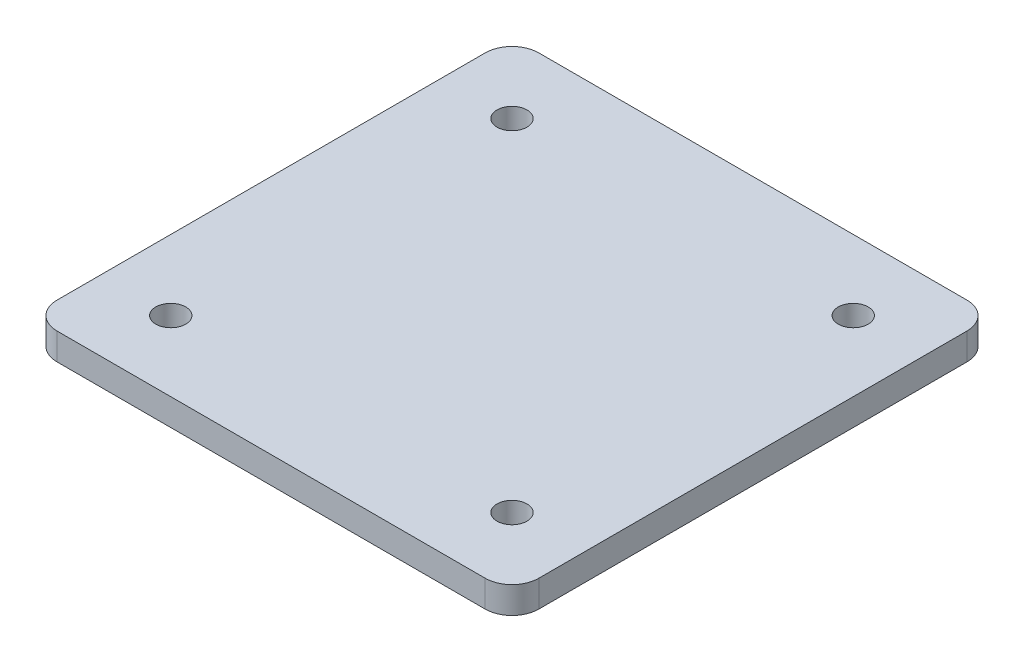
ISO-10303-21;
HEADER;
FILE_DESCRIPTION(('STEP AP214'),'2;1');
FILE_NAME('part.step','',(''),(''),'','','');
FILE_SCHEMA(('AUTOMOTIVE_DESIGN { 1 0 10303 214 1 1 1 1 }'));
ENDSEC;
DATA;
#1=APPLICATION_CONTEXT('core data for automotive mechanical design processes');
#2=APPLICATION_PROTOCOL_DEFINITION('international standard','automotive_design',2000,#1);
#3=PRODUCT_CONTEXT('',#1,'mechanical');
#4=PRODUCT('Part','Part','',(#3));
#5=PRODUCT_RELATED_PRODUCT_CATEGORY('part','',(#4));
#6=PRODUCT_DEFINITION_FORMATION('','',#4);
#7=PRODUCT_DEFINITION_CONTEXT('part definition',#1,'design');
#8=PRODUCT_DEFINITION('design','',#6,#7);
#9=PRODUCT_DEFINITION_SHAPE('','',#8);
#10=(LENGTH_UNIT() NAMED_UNIT(*) SI_UNIT(.MILLI.,.METRE.));
#11=(NAMED_UNIT(*) PLANE_ANGLE_UNIT() SI_UNIT($,.RADIAN.));
#12=(NAMED_UNIT(*) SI_UNIT($,.STERADIAN.) SOLID_ANGLE_UNIT());
#13=UNCERTAINTY_MEASURE_WITH_UNIT(LENGTH_MEASURE(1.E-05),#10,'distance_accuracy_value','');
#14=(GEOMETRIC_REPRESENTATION_CONTEXT(3) GLOBAL_UNCERTAINTY_ASSIGNED_CONTEXT((#13)) GLOBAL_UNIT_ASSIGNED_CONTEXT((#10,
#11,#12)) REPRESENTATION_CONTEXT('',''));
#15=CARTESIAN_POINT('',(0.,0.,0.));
#16=DIRECTION('',(0.,0.,1.));
#17=DIRECTION('',(1.,0.,0.));
#18=AXIS2_PLACEMENT_3D('',#15,#16,#17);
#19=CARTESIAN_POINT('',(0.,2.,0.));
#20=DIRECTION('',(0.,1.,0.));
#21=DIRECTION('',(0.,0.,1.));
#22=AXIS2_PLACEMENT_3D('',#19,#20,#21);
#23=PLANE('',#22);
#24=CARTESIAN_POINT('',(12.75,2.,12.75));
#25=DIRECTION('',(0.,1.,0.));
#26=DIRECTION('',(0.,0.,1.));
#27=AXIS2_PLACEMENT_3D('',#24,#25,#26);
#28=CIRCLE('',#27,1.1189382031963);
#29=CARTESIAN_POINT('',(12.75,2.,13.8689382031963));
#30=VERTEX_POINT('',#29);
#31=EDGE_CURVE('E194',#30,#30,#28,.T.);
#32=ORIENTED_EDGE('',*,*,#31,.F.);
#33=EDGE_LOOP('',(#32));
#34=FACE_BOUND('',#33,.T.);
#35=CARTESIAN_POINT('',(-12.75,2.,-12.75));
#36=DIRECTION('',(0.,1.,0.));
#37=DIRECTION('',(0.,0.,1.));
#38=AXIS2_PLACEMENT_3D('',#35,#36,#37);
#39=CIRCLE('',#38,1.1189382031963);
#40=CARTESIAN_POINT('',(-12.75,2.,-11.6310617968037));
#41=VERTEX_POINT('',#40);
#42=EDGE_CURVE('E180',#41,#41,#39,.T.);
#43=ORIENTED_EDGE('',*,*,#42,.F.);
#44=EDGE_LOOP('',(#43));
#45=FACE_BOUND('',#44,.T.);
#46=DIRECTION('',(-1.,0.,0.));
#47=VECTOR('',#46,1.);
#48=CARTESIAN_POINT('',(-18.,2.,-18.));
#49=LINE('',#48,#47);
#50=CARTESIAN_POINT('',(16.,2.,-18.));
#51=VERTEX_POINT('',#50);
#52=CARTESIAN_POINT('',(-16.,2.,-18.));
#53=VERTEX_POINT('',#52);
#54=EDGE_CURVE('E174',#51,#53,#49,.T.);
#55=ORIENTED_EDGE('',*,*,#54,.T.);
#56=CARTESIAN_POINT('',(-16.,2.,-16.));
#57=DIRECTION('',(0.,1.,0.));
#58=DIRECTION('',(0.,0.,1.));
#59=AXIS2_PLACEMENT_3D('',#56,#57,#58);
#60=CIRCLE('',#59,2.);
#61=CARTESIAN_POINT('',(-18.,2.,-16.));
#62=VERTEX_POINT('',#61);
#63=EDGE_CURVE('E154',#53,#62,#60,.T.);
#64=ORIENTED_EDGE('',*,*,#63,.T.);
#65=DIRECTION('',(0.,0.,1.));
#66=VECTOR('',#65,1.);
#67=CARTESIAN_POINT('',(-18.,2.,-18.));
#68=LINE('',#67,#66);
#69=CARTESIAN_POINT('',(-18.,2.,16.));
#70=VERTEX_POINT('',#69);
#71=EDGE_CURVE('E124',#62,#70,#68,.T.);
#72=ORIENTED_EDGE('',*,*,#71,.T.);
#73=CARTESIAN_POINT('',(-16.,2.,16.));
#74=DIRECTION('',(0.,1.,0.));
#75=DIRECTION('',(0.,0.,1.));
#76=AXIS2_PLACEMENT_3D('',#73,#74,#75);
#77=CIRCLE('',#76,2.);
#78=CARTESIAN_POINT('',(-16.,2.,18.));
#79=VERTEX_POINT('',#78);
#80=EDGE_CURVE('E60',#70,#79,#77,.T.);
#81=ORIENTED_EDGE('',*,*,#80,.T.);
#82=DIRECTION('',(1.,0.,0.));
#83=VECTOR('',#82,1.);
#84=CARTESIAN_POINT('',(-18.,2.,18.));
#85=LINE('',#84,#83);
#86=CARTESIAN_POINT('',(16.,2.,18.));
#87=VERTEX_POINT('',#86);
#88=EDGE_CURVE('E141',#79,#87,#85,.T.);
#89=ORIENTED_EDGE('',*,*,#88,.T.);
#90=CARTESIAN_POINT('',(16.,2.,16.));
#91=DIRECTION('',(0.,1.,0.));
#92=DIRECTION('',(0.,0.,1.));
#93=AXIS2_PLACEMENT_3D('',#90,#91,#92);
#94=CIRCLE('',#93,2.);
#95=CARTESIAN_POINT('',(18.,2.,16.));
#96=VERTEX_POINT('',#95);
#97=EDGE_CURVE('E149',#87,#96,#94,.T.);
#98=ORIENTED_EDGE('',*,*,#97,.T.);
#99=DIRECTION('',(0.,0.,-1.));
#100=VECTOR('',#99,1.);
#101=CARTESIAN_POINT('',(18.,2.,-18.));
#102=LINE('',#101,#100);
#103=CARTESIAN_POINT('',(18.,2.,-16.));
#104=VERTEX_POINT('',#103);
#105=EDGE_CURVE('E135',#96,#104,#102,.T.);
#106=ORIENTED_EDGE('',*,*,#105,.T.);
#107=CARTESIAN_POINT('',(16.,2.,-16.));
#108=DIRECTION('',(0.,1.,0.));
#109=DIRECTION('',(0.,0.,1.));
#110=AXIS2_PLACEMENT_3D('',#107,#108,#109);
#111=CIRCLE('',#110,2.);
#112=EDGE_CURVE('E152',#104,#51,#111,.T.);
#113=ORIENTED_EDGE('',*,*,#112,.T.);
#114=EDGE_LOOP('',(#55,#64,#72,#81,#89,#98,#106,#113));
#115=FACE_BOUND('',#114,.T.);
#116=CARTESIAN_POINT('',(12.75,2.,-12.75));
#117=DIRECTION('',(0.,1.,0.));
#118=DIRECTION('',(0.,0.,-1.));
#119=AXIS2_PLACEMENT_3D('',#116,#117,#118);
#120=CIRCLE('',#119,1.1189382031963);
#121=CARTESIAN_POINT('',(12.75,2.,-13.8689382031963));
#122=VERTEX_POINT('',#121);
#123=EDGE_CURVE('E189',#122,#122,#120,.T.);
#124=ORIENTED_EDGE('',*,*,#123,.F.);
#125=EDGE_LOOP('',(#124));
#126=FACE_BOUND('',#125,.T.);
#127=CARTESIAN_POINT('',(-12.75,2.,12.75));
#128=DIRECTION('',(0.,1.,0.));
#129=DIRECTION('',(0.,0.,-1.));
#130=AXIS2_PLACEMENT_3D('',#127,#128,#129);
#131=CIRCLE('',#130,1.1189382031963);
#132=CARTESIAN_POINT('',(-12.75,2.,11.6310617968037));
#133=VERTEX_POINT('',#132);
#134=EDGE_CURVE('E200',#133,#133,#131,.T.);
#135=ORIENTED_EDGE('',*,*,#134,.F.);
#136=EDGE_LOOP('',(#135));
#137=FACE_BOUND('',#136,.T.);
#138=ADVANCED_FACE('F39',(#34,#45,#115,#126,#137),#23,.T.);
#139=CARTESIAN_POINT('',(0.,0.,0.));
#140=DIRECTION('',(0.,1.,0.));
#141=DIRECTION('',(0.,0.,1.));
#142=AXIS2_PLACEMENT_3D('',#139,#140,#141);
#143=PLANE('',#142);
#144=DIRECTION('',(0.,0.,1.));
#145=VECTOR('',#144,1.);
#146=CARTESIAN_POINT('',(-18.,0.,-18.));
#147=LINE('',#146,#145);
#148=CARTESIAN_POINT('',(-18.,0.,-16.));
#149=VERTEX_POINT('',#148);
#150=CARTESIAN_POINT('',(-18.,0.,16.));
#151=VERTEX_POINT('',#150);
#152=EDGE_CURVE('E122',#149,#151,#147,.T.);
#153=ORIENTED_EDGE('',*,*,#152,.F.);
#154=CARTESIAN_POINT('',(-16.,0.,-16.));
#155=DIRECTION('',(0.,1.,0.));
#156=DIRECTION('',(0.,0.,1.));
#157=AXIS2_PLACEMENT_3D('',#154,#155,#156);
#158=CIRCLE('',#157,2.);
#159=CARTESIAN_POINT('',(-16.,0.,-18.));
#160=VERTEX_POINT('',#159);
#161=EDGE_CURVE('E105',#149,#160,#158,.F.);
#162=ORIENTED_EDGE('',*,*,#161,.T.);
#163=DIRECTION('',(-1.,0.,0.));
#164=VECTOR('',#163,1.);
#165=CARTESIAN_POINT('',(-18.,0.,-18.));
#166=LINE('',#165,#164);
#167=CARTESIAN_POINT('',(16.,0.,-18.));
#168=VERTEX_POINT('',#167);
#169=EDGE_CURVE('E133',#168,#160,#166,.T.);
#170=ORIENTED_EDGE('',*,*,#169,.F.);
#171=CARTESIAN_POINT('',(16.,0.,-16.));
#172=DIRECTION('',(0.,1.,0.));
#173=DIRECTION('',(0.,0.,1.));
#174=AXIS2_PLACEMENT_3D('',#171,#172,#173);
#175=CIRCLE('',#174,2.);
#176=CARTESIAN_POINT('',(18.,0.,-16.));
#177=VERTEX_POINT('',#176);
#178=EDGE_CURVE('E116',#168,#177,#175,.F.);
#179=ORIENTED_EDGE('',*,*,#178,.T.);
#180=DIRECTION('',(0.,0.,-1.));
#181=VECTOR('',#180,1.);
#182=CARTESIAN_POINT('',(18.,0.,-18.));
#183=LINE('',#182,#181);
#184=CARTESIAN_POINT('',(18.,0.,16.));
#185=VERTEX_POINT('',#184);
#186=EDGE_CURVE('E137',#185,#177,#183,.T.);
#187=ORIENTED_EDGE('',*,*,#186,.F.);
#188=CARTESIAN_POINT('',(16.,0.,16.));
#189=DIRECTION('',(0.,1.,0.));
#190=DIRECTION('',(0.,0.,1.));
#191=AXIS2_PLACEMENT_3D('',#188,#189,#190);
#192=CIRCLE('',#191,2.);
#193=CARTESIAN_POINT('',(16.,0.,18.));
#194=VERTEX_POINT('',#193);
#195=EDGE_CURVE('E125',#185,#194,#192,.F.);
#196=ORIENTED_EDGE('',*,*,#195,.T.);
#197=DIRECTION('',(1.,0.,0.));
#198=VECTOR('',#197,1.);
#199=CARTESIAN_POINT('',(-18.,0.,18.));
#200=LINE('',#199,#198);
#201=CARTESIAN_POINT('',(-16.,0.,18.));
#202=VERTEX_POINT('',#201);
#203=EDGE_CURVE('E132',#202,#194,#200,.T.);
#204=ORIENTED_EDGE('',*,*,#203,.F.);
#205=CARTESIAN_POINT('',(-16.,0.,16.));
#206=DIRECTION('',(0.,1.,0.));
#207=DIRECTION('',(0.,0.,1.));
#208=AXIS2_PLACEMENT_3D('',#205,#206,#207);
#209=CIRCLE('',#208,2.);
#210=EDGE_CURVE('E131',#202,#151,#209,.F.);
#211=ORIENTED_EDGE('',*,*,#210,.T.);
#212=EDGE_LOOP('',(#153,#162,#170,#179,#187,#196,#204,#211));
#213=FACE_BOUND('',#212,.T.);
#214=CARTESIAN_POINT('',(-12.75,0.,-12.75));
#215=DIRECTION('',(0.,1.,0.));
#216=DIRECTION('',(0.,0.,1.));
#217=AXIS2_PLACEMENT_3D('',#214,#215,#216);
#218=CIRCLE('',#217,1.1189382031963);
#219=CARTESIAN_POINT('',(-12.75,0.,-11.6310617968037));
#220=VERTEX_POINT('',#219);
#221=EDGE_CURVE('E182',#220,#220,#218,.T.);
#222=ORIENTED_EDGE('',*,*,#221,.T.);
#223=EDGE_LOOP('',(#222));
#224=FACE_BOUND('',#223,.T.);
#225=CARTESIAN_POINT('',(12.75,0.,-12.75));
#226=DIRECTION('',(0.,1.,0.));
#227=DIRECTION('',(0.,0.,-1.));
#228=AXIS2_PLACEMENT_3D('',#225,#226,#227);
#229=CIRCLE('',#228,1.1189382031963);
#230=CARTESIAN_POINT('',(12.75,0.,-13.8689382031963));
#231=VERTEX_POINT('',#230);
#232=EDGE_CURVE('E191',#231,#231,#229,.T.);
#233=ORIENTED_EDGE('',*,*,#232,.T.);
#234=EDGE_LOOP('',(#233));
#235=FACE_BOUND('',#234,.T.);
#236=CARTESIAN_POINT('',(12.75,0.,12.75));
#237=DIRECTION('',(0.,1.,0.));
#238=DIRECTION('',(0.,0.,1.));
#239=AXIS2_PLACEMENT_3D('',#236,#237,#238);
#240=CIRCLE('',#239,1.1189382031963);
#241=CARTESIAN_POINT('',(12.75,0.,13.8689382031963));
#242=VERTEX_POINT('',#241);
#243=EDGE_CURVE('E197',#242,#242,#240,.T.);
#244=ORIENTED_EDGE('',*,*,#243,.T.);
#245=EDGE_LOOP('',(#244));
#246=FACE_BOUND('',#245,.T.);
#247=CARTESIAN_POINT('',(-12.75,0.,12.75));
#248=DIRECTION('',(0.,1.,0.));
#249=DIRECTION('',(0.,0.,-1.));
#250=AXIS2_PLACEMENT_3D('',#247,#248,#249);
#251=CIRCLE('',#250,1.1189382031963);
#252=CARTESIAN_POINT('',(-12.75,0.,11.6310617968037));
#253=VERTEX_POINT('',#252);
#254=EDGE_CURVE('E203',#253,#253,#251,.T.);
#255=ORIENTED_EDGE('',*,*,#254,.T.);
#256=EDGE_LOOP('',(#255));
#257=FACE_BOUND('',#256,.T.);
#258=ADVANCED_FACE('F128',(#213,#224,#235,#246,#257),#143,.F.);
#259=CARTESIAN_POINT('',(18.,2.,-18.));
#260=DIRECTION('',(-1.,0.,0.));
#261=DIRECTION('',(0.,0.,1.));
#262=AXIS2_PLACEMENT_3D('',#259,#260,#261);
#263=PLANE('',#262);
#264=ORIENTED_EDGE('',*,*,#186,.T.);
#265=DIRECTION('',(0.,-1.,0.));
#266=VECTOR('',#265,1.);
#267=CARTESIAN_POINT('',(18.,2.,-16.));
#268=LINE('',#267,#266);
#269=EDGE_CURVE('E159',#177,#104,#268,.F.);
#270=ORIENTED_EDGE('',*,*,#269,.T.);
#271=ORIENTED_EDGE('',*,*,#105,.F.);
#272=DIRECTION('',(0.,-1.,0.));
#273=VECTOR('',#272,1.);
#274=CARTESIAN_POINT('',(18.,2.,16.));
#275=LINE('',#274,#273);
#276=EDGE_CURVE('E156',#96,#185,#275,.T.);
#277=ORIENTED_EDGE('',*,*,#276,.T.);
#278=EDGE_LOOP('',(#264,#270,#271,#277));
#279=FACE_BOUND('',#278,.T.);
#280=ADVANCED_FACE('F165',(#279),#263,.F.);
#281=CARTESIAN_POINT('',(-18.,2.,-18.));
#282=DIRECTION('',(0.,0.,1.));
#283=DIRECTION('',(1.,0.,0.));
#284=AXIS2_PLACEMENT_3D('',#281,#282,#283);
#285=PLANE('',#284);
#286=ORIENTED_EDGE('',*,*,#169,.T.);
#287=DIRECTION('',(0.,-1.,0.));
#288=VECTOR('',#287,1.);
#289=CARTESIAN_POINT('',(-16.,2.,-18.));
#290=LINE('',#289,#288);
#291=EDGE_CURVE('E110',#160,#53,#290,.F.);
#292=ORIENTED_EDGE('',*,*,#291,.T.);
#293=ORIENTED_EDGE('',*,*,#54,.F.);
#294=DIRECTION('',(0.,-1.,0.));
#295=VECTOR('',#294,1.);
#296=CARTESIAN_POINT('',(16.,2.,-18.));
#297=LINE('',#296,#295);
#298=EDGE_CURVE('E115',#51,#168,#297,.T.);
#299=ORIENTED_EDGE('',*,*,#298,.T.);
#300=EDGE_LOOP('',(#286,#292,#293,#299));
#301=FACE_BOUND('',#300,.T.);
#302=ADVANCED_FACE('F179',(#301),#285,.F.);
#303=CARTESIAN_POINT('',(-18.,2.,-18.));
#304=DIRECTION('',(1.,0.,0.));
#305=DIRECTION('',(0.,0.,-1.));
#306=AXIS2_PLACEMENT_3D('',#303,#304,#305);
#307=PLANE('',#306);
#308=ORIENTED_EDGE('',*,*,#71,.F.);
#309=DIRECTION('',(0.,-1.,0.));
#310=VECTOR('',#309,1.);
#311=CARTESIAN_POINT('',(-18.,2.,-16.));
#312=LINE('',#311,#310);
#313=EDGE_CURVE('E109',#62,#149,#312,.T.);
#314=ORIENTED_EDGE('',*,*,#313,.T.);
#315=ORIENTED_EDGE('',*,*,#152,.T.);
#316=DIRECTION('',(0.,-1.,0.));
#317=VECTOR('',#316,1.);
#318=CARTESIAN_POINT('',(-18.,2.,16.));
#319=LINE('',#318,#317);
#320=EDGE_CURVE('E126',#151,#70,#319,.F.);
#321=ORIENTED_EDGE('',*,*,#320,.T.);
#322=EDGE_LOOP('',(#308,#314,#315,#321));
#323=FACE_BOUND('',#322,.T.);
#324=ADVANCED_FACE('F121',(#323),#307,.F.);
#325=CARTESIAN_POINT('',(-18.,2.,18.));
#326=DIRECTION('',(0.,0.,-1.));
#327=DIRECTION('',(-1.,0.,0.));
#328=AXIS2_PLACEMENT_3D('',#325,#326,#327);
#329=PLANE('',#328);
#330=ORIENTED_EDGE('',*,*,#88,.F.);
#331=DIRECTION('',(0.,-1.,0.));
#332=VECTOR('',#331,1.);
#333=CARTESIAN_POINT('',(-16.,2.,18.));
#334=LINE('',#333,#332);
#335=EDGE_CURVE('E11',#79,#202,#334,.T.);
#336=ORIENTED_EDGE('',*,*,#335,.T.);
#337=ORIENTED_EDGE('',*,*,#203,.T.);
#338=DIRECTION('',(0.,-1.,0.));
#339=VECTOR('',#338,1.);
#340=CARTESIAN_POINT('',(16.,2.,18.));
#341=LINE('',#340,#339);
#342=EDGE_CURVE('E47',#194,#87,#341,.F.);
#343=ORIENTED_EDGE('',*,*,#342,.T.);
#344=EDGE_LOOP('',(#330,#336,#337,#343));
#345=FACE_BOUND('',#344,.T.);
#346=ADVANCED_FACE('F226',(#345),#329,.F.);
#347=CARTESIAN_POINT('',(-12.75,2.,-12.75));
#348=DIRECTION('',(0.,-1.,0.));
#349=DIRECTION('',(0.,0.,-1.));
#350=AXIS2_PLACEMENT_3D('',#347,#348,#349);
#351=CYLINDRICAL_SURFACE('',#350,1.1189382031963);
#352=ORIENTED_EDGE('',*,*,#42,.T.);
#353=EDGE_LOOP('',(#352));
#354=FACE_BOUND('',#353,.T.);
#355=ORIENTED_EDGE('',*,*,#221,.F.);
#356=EDGE_LOOP('',(#355));
#357=FACE_BOUND('',#356,.T.);
#358=ADVANCED_FACE('F223',(#354,#357),#351,.F.);
#359=CARTESIAN_POINT('',(12.75,2.,-12.75));
#360=DIRECTION('',(0.,-1.,0.));
#361=DIRECTION('',(0.,0.,-1.));
#362=AXIS2_PLACEMENT_3D('',#359,#360,#361);
#363=CYLINDRICAL_SURFACE('',#362,1.1189382031963);
#364=ORIENTED_EDGE('',*,*,#123,.T.);
#365=EDGE_LOOP('',(#364));
#366=FACE_BOUND('',#365,.T.);
#367=ORIENTED_EDGE('',*,*,#232,.F.);
#368=EDGE_LOOP('',(#367));
#369=FACE_BOUND('',#368,.T.);
#370=ADVANCED_FACE('F282',(#366,#369),#363,.F.);
#371=CARTESIAN_POINT('',(12.75,2.,12.75));
#372=DIRECTION('',(0.,-1.,0.));
#373=DIRECTION('',(0.,0.,-1.));
#374=AXIS2_PLACEMENT_3D('',#371,#372,#373);
#375=CYLINDRICAL_SURFACE('',#374,1.1189382031963);
#376=ORIENTED_EDGE('',*,*,#31,.T.);
#377=EDGE_LOOP('',(#376));
#378=FACE_BOUND('',#377,.T.);
#379=ORIENTED_EDGE('',*,*,#243,.F.);
#380=EDGE_LOOP('',(#379));
#381=FACE_BOUND('',#380,.T.);
#382=ADVANCED_FACE('F273',(#378,#381),#375,.F.);
#383=CARTESIAN_POINT('',(-12.75,2.,12.75));
#384=DIRECTION('',(0.,-1.,0.));
#385=DIRECTION('',(0.,0.,-1.));
#386=AXIS2_PLACEMENT_3D('',#383,#384,#385);
#387=CYLINDRICAL_SURFACE('',#386,1.1189382031963);
#388=ORIENTED_EDGE('',*,*,#134,.T.);
#389=EDGE_LOOP('',(#388));
#390=FACE_BOUND('',#389,.T.);
#391=ORIENTED_EDGE('',*,*,#254,.F.);
#392=EDGE_LOOP('',(#391));
#393=FACE_BOUND('',#392,.T.);
#394=ADVANCED_FACE('F209',(#390,#393),#387,.F.);
#395=CARTESIAN_POINT('',(-16.,2.,-16.));
#396=DIRECTION('',(0.,-1.,0.));
#397=DIRECTION('',(0.,0.,-1.));
#398=AXIS2_PLACEMENT_3D('',#395,#396,#397);
#399=CYLINDRICAL_SURFACE('',#398,2.);
#400=ORIENTED_EDGE('',*,*,#63,.F.);
#401=ORIENTED_EDGE('',*,*,#291,.F.);
#402=ORIENTED_EDGE('',*,*,#161,.F.);
#403=ORIENTED_EDGE('',*,*,#313,.F.);
#404=EDGE_LOOP('',(#400,#401,#402,#403));
#405=FACE_BOUND('',#404,.T.);
#406=ADVANCED_FACE('F108',(#405),#399,.T.);
#407=CARTESIAN_POINT('',(16.,2.,-16.));
#408=DIRECTION('',(0.,-1.,0.));
#409=DIRECTION('',(0.,0.,-1.));
#410=AXIS2_PLACEMENT_3D('',#407,#408,#409);
#411=CYLINDRICAL_SURFACE('',#410,2.);
#412=ORIENTED_EDGE('',*,*,#112,.F.);
#413=ORIENTED_EDGE('',*,*,#269,.F.);
#414=ORIENTED_EDGE('',*,*,#178,.F.);
#415=ORIENTED_EDGE('',*,*,#298,.F.);
#416=EDGE_LOOP('',(#412,#413,#414,#415));
#417=FACE_BOUND('',#416,.T.);
#418=ADVANCED_FACE('F177',(#417),#411,.T.);
#419=CARTESIAN_POINT('',(-16.,2.,16.));
#420=DIRECTION('',(0.,-1.,0.));
#421=DIRECTION('',(0.,0.,-1.));
#422=AXIS2_PLACEMENT_3D('',#419,#420,#421);
#423=CYLINDRICAL_SURFACE('',#422,2.);
#424=ORIENTED_EDGE('',*,*,#80,.F.);
#425=ORIENTED_EDGE('',*,*,#320,.F.);
#426=ORIENTED_EDGE('',*,*,#210,.F.);
#427=ORIENTED_EDGE('',*,*,#335,.F.);
#428=EDGE_LOOP('',(#424,#425,#426,#427));
#429=FACE_BOUND('',#428,.T.);
#430=ADVANCED_FACE('F238',(#429),#423,.T.);
#431=CARTESIAN_POINT('',(16.,2.,16.));
#432=DIRECTION('',(0.,-1.,0.));
#433=DIRECTION('',(0.,0.,-1.));
#434=AXIS2_PLACEMENT_3D('',#431,#432,#433);
#435=CYLINDRICAL_SURFACE('',#434,2.);
#436=ORIENTED_EDGE('',*,*,#97,.F.);
#437=ORIENTED_EDGE('',*,*,#342,.F.);
#438=ORIENTED_EDGE('',*,*,#195,.F.);
#439=ORIENTED_EDGE('',*,*,#276,.F.);
#440=EDGE_LOOP('',(#436,#437,#438,#439));
#441=FACE_BOUND('',#440,.T.);
#442=ADVANCED_FACE('F41',(#441),#435,.T.);
#443=CLOSED_SHELL('',(#138,#258,#280,#302,#324,#346,#358,#370,#382,#394,#406,#418,#430,#442));
#444=MANIFOLD_SOLID_BREP('B2',#443);
#445=ADVANCED_BREP_SHAPE_REPRESENTATION('',(#18,#444),#14);
#446=SHAPE_DEFINITION_REPRESENTATION(#9,#445);
ENDSEC;
END-ISO-10303-21;
